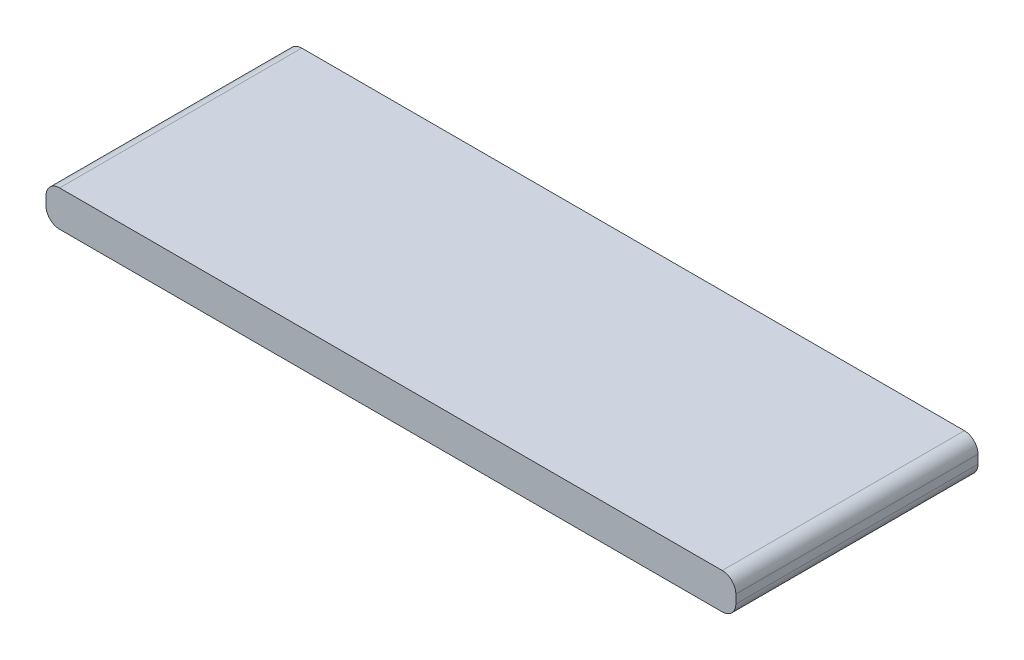
ISO-10303-21;
HEADER;
FILE_DESCRIPTION(('STEP AP214'),'2;1');
FILE_NAME('part.step','',(''),(''),'','','');
FILE_SCHEMA(('AUTOMOTIVE_DESIGN { 1 0 10303 214 1 1 1 1 }'));
ENDSEC;
DATA;
#1=APPLICATION_CONTEXT('core data for automotive mechanical design processes');
#2=APPLICATION_PROTOCOL_DEFINITION('international standard','automotive_design',2000,#1);
#3=PRODUCT_CONTEXT('',#1,'mechanical');
#4=PRODUCT('Part','Part','',(#3));
#5=PRODUCT_RELATED_PRODUCT_CATEGORY('part','',(#4));
#6=PRODUCT_DEFINITION_FORMATION('','',#4);
#7=PRODUCT_DEFINITION_CONTEXT('part definition',#1,'design');
#8=PRODUCT_DEFINITION('design','',#6,#7);
#9=PRODUCT_DEFINITION_SHAPE('','',#8);
#10=(LENGTH_UNIT() NAMED_UNIT(*) SI_UNIT(.MILLI.,.METRE.));
#11=(NAMED_UNIT(*) PLANE_ANGLE_UNIT() SI_UNIT($,.RADIAN.));
#12=(NAMED_UNIT(*) SI_UNIT($,.STERADIAN.) SOLID_ANGLE_UNIT());
#13=UNCERTAINTY_MEASURE_WITH_UNIT(LENGTH_MEASURE(1.E-05),#10,'distance_accuracy_value','');
#14=(GEOMETRIC_REPRESENTATION_CONTEXT(3) GLOBAL_UNCERTAINTY_ASSIGNED_CONTEXT((#13)) GLOBAL_UNIT_ASSIGNED_CONTEXT((#10,
#11,#12)) REPRESENTATION_CONTEXT('',''));
#15=CARTESIAN_POINT('',(0.,0.,0.));
#16=DIRECTION('',(0.,0.,1.));
#17=DIRECTION('',(1.,0.,0.));
#18=AXIS2_PLACEMENT_3D('',#15,#16,#17);
#19=CARTESIAN_POINT('',(152.4,0.,53.499999934));
#20=DIRECTION('',(0.,1.,0.));
#21=DIRECTION('',(-1.,0.,0.));
#22=AXIS2_PLACEMENT_3D('',#19,#20,#21);
#23=PLANE('',#22);
#24=DIRECTION('',(1.,0.,0.));
#25=VECTOR('',#24,1.);
#26=CARTESIAN_POINT('',(152.4,0.,0.));
#27=LINE('',#26,#25);
#28=CARTESIAN_POINT('',(3.00000000000006,0.,0.));
#29=VERTEX_POINT('',#28);
#30=CARTESIAN_POINT('',(149.4,0.,0.));
#31=VERTEX_POINT('',#30);
#32=EDGE_CURVE('E142',#29,#31,#27,.T.);
#33=ORIENTED_EDGE('',*,*,#32,.T.);
#34=DIRECTION('',(0.,0.,-1.));
#35=VECTOR('',#34,1.);
#36=CARTESIAN_POINT('',(149.4,0.,53.499999934));
#37=LINE('',#36,#35);
#38=CARTESIAN_POINT('',(149.4,0.,53.499999934));
#39=VERTEX_POINT('',#38);
#40=EDGE_CURVE('E164',#31,#39,#37,.F.);
#41=ORIENTED_EDGE('',*,*,#40,.T.);
#42=DIRECTION('',(1.,0.,0.));
#43=VECTOR('',#42,1.);
#44=CARTESIAN_POINT('',(152.4,0.,53.499999934));
#45=LINE('',#44,#43);
#46=CARTESIAN_POINT('',(3.00000000000006,0.,53.499999934));
#47=VERTEX_POINT('',#46);
#48=EDGE_CURVE('E140',#47,#39,#45,.T.);
#49=ORIENTED_EDGE('',*,*,#48,.F.);
#50=DIRECTION('',(0.,0.,-1.));
#51=VECTOR('',#50,1.);
#52=CARTESIAN_POINT('',(3.,0.,53.499999934));
#53=LINE('',#52,#51);
#54=EDGE_CURVE('E161',#47,#29,#53,.T.);
#55=ORIENTED_EDGE('',*,*,#54,.T.);
#56=EDGE_LOOP('',(#33,#41,#49,#55));
#57=FACE_BOUND('',#56,.T.);
#58=ADVANCED_FACE('F45',(#57),#23,.F.);
#59=CARTESIAN_POINT('',(152.4,7.92406687544473,53.499999934));
#60=DIRECTION('',(-1.,0.,0.));
#61=DIRECTION('',(0.,0.,1.));
#62=AXIS2_PLACEMENT_3D('',#59,#60,#61);
#63=PLANE('',#62);
#64=DIRECTION('',(0.,1.,0.));
#65=VECTOR('',#64,1.);
#66=CARTESIAN_POINT('',(152.4,7.92406687544473,0.));
#67=LINE('',#66,#65);
#68=CARTESIAN_POINT('',(152.4,3.00000000000002,0.));
#69=VERTEX_POINT('',#68);
#70=CARTESIAN_POINT('',(152.4,4.92406687544473,0.));
#71=VERTEX_POINT('',#70);
#72=EDGE_CURVE('E138',#69,#71,#67,.T.);
#73=ORIENTED_EDGE('',*,*,#72,.T.);
#74=DIRECTION('',(0.,0.,-1.));
#75=VECTOR('',#74,1.);
#76=CARTESIAN_POINT('',(152.4,4.92406687544473,53.499999934));
#77=LINE('',#76,#75);
#78=CARTESIAN_POINT('',(152.4,4.92406687544473,53.499999934));
#79=VERTEX_POINT('',#78);
#80=EDGE_CURVE('E116',#71,#79,#77,.F.);
#81=ORIENTED_EDGE('',*,*,#80,.T.);
#82=DIRECTION('',(0.,1.,0.));
#83=VECTOR('',#82,1.);
#84=CARTESIAN_POINT('',(152.4,7.92406687544473,53.499999934));
#85=LINE('',#84,#83);
#86=CARTESIAN_POINT('',(152.4,3.00000000000002,53.499999934));
#87=VERTEX_POINT('',#86);
#88=EDGE_CURVE('E178',#87,#79,#85,.T.);
#89=ORIENTED_EDGE('',*,*,#88,.F.);
#90=DIRECTION('',(0.,0.,-1.));
#91=VECTOR('',#90,1.);
#92=CARTESIAN_POINT('',(152.4,3.00000000000002,53.499999934));
#93=LINE('',#92,#91);
#94=EDGE_CURVE('E121',#87,#69,#93,.T.);
#95=ORIENTED_EDGE('',*,*,#94,.T.);
#96=EDGE_LOOP('',(#73,#81,#89,#95));
#97=FACE_BOUND('',#96,.T.);
#98=ADVANCED_FACE('F183',(#97),#63,.F.);
#99=CARTESIAN_POINT('',(152.4,7.92406687544473,53.499999934));
#100=DIRECTION('',(0.,-1.,0.));
#101=DIRECTION('',(1.,0.,0.));
#102=AXIS2_PLACEMENT_3D('',#99,#100,#101);
#103=PLANE('',#102);
#104=DIRECTION('',(-1.,0.,0.));
#105=VECTOR('',#104,1.);
#106=CARTESIAN_POINT('',(152.4,7.92406687544473,53.499999934));
#107=LINE('',#106,#105);
#108=CARTESIAN_POINT('',(149.4,7.92406687544473,53.499999934));
#109=VERTEX_POINT('',#108);
#110=CARTESIAN_POINT('',(3.00000000000006,7.92406687544471,53.499999934));
#111=VERTEX_POINT('',#110);
#112=EDGE_CURVE('E130',#109,#111,#107,.T.);
#113=ORIENTED_EDGE('',*,*,#112,.F.);
#114=DIRECTION('',(0.,0.,-1.));
#115=VECTOR('',#114,1.);
#116=CARTESIAN_POINT('',(149.4,7.92406687544473,53.499999934));
#117=LINE('',#116,#115);
#118=CARTESIAN_POINT('',(149.4,7.92406687544473,0.));
#119=VERTEX_POINT('',#118);
#120=EDGE_CURVE('E115',#109,#119,#117,.T.);
#121=ORIENTED_EDGE('',*,*,#120,.T.);
#122=DIRECTION('',(-1.,0.,0.));
#123=VECTOR('',#122,1.);
#124=CARTESIAN_POINT('',(152.4,7.92406687544473,0.));
#125=LINE('',#124,#123);
#126=CARTESIAN_POINT('',(3.00000000000006,7.92406687544471,0.));
#127=VERTEX_POINT('',#126);
#128=EDGE_CURVE('E128',#119,#127,#125,.T.);
#129=ORIENTED_EDGE('',*,*,#128,.T.);
#130=DIRECTION('',(0.,0.,-1.));
#131=VECTOR('',#130,1.);
#132=CARTESIAN_POINT('',(3.,7.92406687544471,53.499999934));
#133=LINE('',#132,#131);
#134=EDGE_CURVE('E132',#127,#111,#133,.F.);
#135=ORIENTED_EDGE('',*,*,#134,.T.);
#136=EDGE_LOOP('',(#113,#121,#129,#135));
#137=FACE_BOUND('',#136,.T.);
#138=ADVANCED_FACE('F127',(#137),#103,.F.);
#139=CARTESIAN_POINT('',(0.,7.92406687544471,53.499999934));
#140=DIRECTION('',(1.,0.,0.));
#141=DIRECTION('',(0.,0.,-1.));
#142=AXIS2_PLACEMENT_3D('',#139,#140,#141);
#143=PLANE('',#142);
#144=DIRECTION('',(0.,-1.,0.));
#145=VECTOR('',#144,1.);
#146=CARTESIAN_POINT('',(0.,7.92406687544471,53.499999934));
#147=LINE('',#146,#145);
#148=CARTESIAN_POINT('',(0.,4.92406687544471,53.499999934));
#149=VERTEX_POINT('',#148);
#150=CARTESIAN_POINT('',(0.,3.,53.499999934));
#151=VERTEX_POINT('',#150);
#152=EDGE_CURVE('E146',#149,#151,#147,.T.);
#153=ORIENTED_EDGE('',*,*,#152,.F.);
#154=DIRECTION('',(0.,0.,-1.));
#155=VECTOR('',#154,1.);
#156=CARTESIAN_POINT('',(0.,4.92406687544471,53.499999934));
#157=LINE('',#156,#155);
#158=CARTESIAN_POINT('',(0.,4.92406687544471,0.));
#159=VERTEX_POINT('',#158);
#160=EDGE_CURVE('E11',#149,#159,#157,.T.);
#161=ORIENTED_EDGE('',*,*,#160,.T.);
#162=DIRECTION('',(0.,-1.,0.));
#163=VECTOR('',#162,1.);
#164=CARTESIAN_POINT('',(0.,7.92406687544471,0.));
#165=LINE('',#164,#163);
#166=CARTESIAN_POINT('',(0.,3.,0.));
#167=VERTEX_POINT('',#166);
#168=EDGE_CURVE('E137',#159,#167,#165,.T.);
#169=ORIENTED_EDGE('',*,*,#168,.T.);
#170=DIRECTION('',(0.,0.,-1.));
#171=VECTOR('',#170,1.);
#172=CARTESIAN_POINT('',(0.,3.,53.499999934));
#173=LINE('',#172,#171);
#174=EDGE_CURVE('E53',#167,#151,#173,.F.);
#175=ORIENTED_EDGE('',*,*,#174,.T.);
#176=EDGE_LOOP('',(#153,#161,#169,#175));
#177=FACE_BOUND('',#176,.T.);
#178=ADVANCED_FACE('F190',(#177),#143,.F.);
#179=CARTESIAN_POINT('',(0.,0.,53.499999934));
#180=DIRECTION('',(0.,0.,1.));
#181=DIRECTION('',(1.,0.,0.));
#182=AXIS2_PLACEMENT_3D('',#179,#180,#181);
#183=PLANE('',#182);
#184=ORIENTED_EDGE('',*,*,#88,.T.);
#185=CARTESIAN_POINT('',(149.4,4.92406687544473,53.499999934));
#186=DIRECTION('',(0.,0.,1.));
#187=DIRECTION('',(1.,0.,0.));
#188=AXIS2_PLACEMENT_3D('',#185,#186,#187);
#189=CIRCLE('',#188,3.);
#190=EDGE_CURVE('E159',#79,#109,#189,.T.);
#191=ORIENTED_EDGE('',*,*,#190,.T.);
#192=ORIENTED_EDGE('',*,*,#112,.T.);
#193=CARTESIAN_POINT('',(3.,4.92406687544471,53.499999934));
#194=DIRECTION('',(0.,0.,1.));
#195=DIRECTION('',(1.,0.,0.));
#196=AXIS2_PLACEMENT_3D('',#193,#194,#195);
#197=CIRCLE('',#196,3.);
#198=EDGE_CURVE('E66',#111,#149,#197,.T.);
#199=ORIENTED_EDGE('',*,*,#198,.T.);
#200=ORIENTED_EDGE('',*,*,#152,.T.);
#201=CARTESIAN_POINT('',(3.,3.,53.499999934));
#202=DIRECTION('',(0.,0.,1.));
#203=DIRECTION('',(1.,0.,0.));
#204=AXIS2_PLACEMENT_3D('',#201,#202,#203);
#205=CIRCLE('',#204,3.);
#206=EDGE_CURVE('E154',#151,#47,#205,.T.);
#207=ORIENTED_EDGE('',*,*,#206,.T.);
#208=ORIENTED_EDGE('',*,*,#48,.T.);
#209=CARTESIAN_POINT('',(149.4,3.00000000000002,53.499999934));
#210=DIRECTION('',(0.,0.,1.));
#211=DIRECTION('',(1.,0.,0.));
#212=AXIS2_PLACEMENT_3D('',#209,#210,#211);
#213=CIRCLE('',#212,3.);
#214=EDGE_CURVE('E157',#39,#87,#213,.T.);
#215=ORIENTED_EDGE('',*,*,#214,.T.);
#216=EDGE_LOOP('',(#184,#191,#192,#199,#200,#207,#208,#215));
#217=FACE_BOUND('',#216,.T.);
#218=ADVANCED_FACE('F175',(#217),#183,.T.);
#219=CARTESIAN_POINT('',(0.,0.,0.));
#220=DIRECTION('',(0.,0.,1.));
#221=DIRECTION('',(1.,0.,0.));
#222=AXIS2_PLACEMENT_3D('',#219,#220,#221);
#223=PLANE('',#222);
#224=ORIENTED_EDGE('',*,*,#128,.F.);
#225=CARTESIAN_POINT('',(149.4,4.92406687544473,0.));
#226=DIRECTION('',(0.,0.,1.));
#227=DIRECTION('',(1.,0.,0.));
#228=AXIS2_PLACEMENT_3D('',#225,#226,#227);
#229=CIRCLE('',#228,3.);
#230=EDGE_CURVE('E111',#119,#71,#229,.F.);
#231=ORIENTED_EDGE('',*,*,#230,.T.);
#232=ORIENTED_EDGE('',*,*,#72,.F.);
#233=CARTESIAN_POINT('',(149.4,3.00000000000002,0.));
#234=DIRECTION('',(0.,0.,1.));
#235=DIRECTION('',(1.,0.,0.));
#236=AXIS2_PLACEMENT_3D('',#233,#234,#235);
#237=CIRCLE('',#236,3.);
#238=EDGE_CURVE('E122',#69,#31,#237,.F.);
#239=ORIENTED_EDGE('',*,*,#238,.T.);
#240=ORIENTED_EDGE('',*,*,#32,.F.);
#241=CARTESIAN_POINT('',(3.,3.,0.));
#242=DIRECTION('',(0.,0.,1.));
#243=DIRECTION('',(1.,0.,0.));
#244=AXIS2_PLACEMENT_3D('',#241,#242,#243);
#245=CIRCLE('',#244,3.);
#246=EDGE_CURVE('E131',#29,#167,#245,.F.);
#247=ORIENTED_EDGE('',*,*,#246,.T.);
#248=ORIENTED_EDGE('',*,*,#168,.F.);
#249=CARTESIAN_POINT('',(3.,4.92406687544471,0.));
#250=DIRECTION('',(0.,0.,1.));
#251=DIRECTION('',(1.,0.,0.));
#252=AXIS2_PLACEMENT_3D('',#249,#250,#251);
#253=CIRCLE('',#252,3.);
#254=EDGE_CURVE('E136',#159,#127,#253,.F.);
#255=ORIENTED_EDGE('',*,*,#254,.T.);
#256=EDGE_LOOP('',(#224,#231,#232,#239,#240,#247,#248,#255));
#257=FACE_BOUND('',#256,.T.);
#258=ADVANCED_FACE('F134',(#257),#223,.F.);
#259=CARTESIAN_POINT('',(149.4,4.92406687544473,53.499999934));
#260=DIRECTION('',(0.,0.,-1.));
#261=DIRECTION('',(-1.,0.,0.));
#262=AXIS2_PLACEMENT_3D('',#259,#260,#261);
#263=CYLINDRICAL_SURFACE('',#262,3.);
#264=ORIENTED_EDGE('',*,*,#190,.F.);
#265=ORIENTED_EDGE('',*,*,#80,.F.);
#266=ORIENTED_EDGE('',*,*,#230,.F.);
#267=ORIENTED_EDGE('',*,*,#120,.F.);
#268=EDGE_LOOP('',(#264,#265,#266,#267));
#269=FACE_BOUND('',#268,.T.);
#270=ADVANCED_FACE('F114',(#269),#263,.T.);
#271=CARTESIAN_POINT('',(149.4,3.00000000000002,53.499999934));
#272=DIRECTION('',(0.,0.,-1.));
#273=DIRECTION('',(-1.,0.,0.));
#274=AXIS2_PLACEMENT_3D('',#271,#272,#273);
#275=CYLINDRICAL_SURFACE('',#274,3.);
#276=ORIENTED_EDGE('',*,*,#214,.F.);
#277=ORIENTED_EDGE('',*,*,#40,.F.);
#278=ORIENTED_EDGE('',*,*,#238,.F.);
#279=ORIENTED_EDGE('',*,*,#94,.F.);
#280=EDGE_LOOP('',(#276,#277,#278,#279));
#281=FACE_BOUND('',#280,.T.);
#282=ADVANCED_FACE('F181',(#281),#275,.T.);
#283=CARTESIAN_POINT('',(3.,4.92406687544471,53.499999934));
#284=DIRECTION('',(0.,0.,-1.));
#285=DIRECTION('',(-1.,0.,0.));
#286=AXIS2_PLACEMENT_3D('',#283,#284,#285);
#287=CYLINDRICAL_SURFACE('',#286,3.);
#288=ORIENTED_EDGE('',*,*,#198,.F.);
#289=ORIENTED_EDGE('',*,*,#134,.F.);
#290=ORIENTED_EDGE('',*,*,#254,.F.);
#291=ORIENTED_EDGE('',*,*,#160,.F.);
#292=EDGE_LOOP('',(#288,#289,#290,#291));
#293=FACE_BOUND('',#292,.T.);
#294=ADVANCED_FACE('F189',(#293),#287,.T.);
#295=CARTESIAN_POINT('',(3.,3.,53.499999934));
#296=DIRECTION('',(0.,0.,-1.));
#297=DIRECTION('',(-1.,0.,0.));
#298=AXIS2_PLACEMENT_3D('',#295,#296,#297);
#299=CYLINDRICAL_SURFACE('',#298,3.);
#300=ORIENTED_EDGE('',*,*,#206,.F.);
#301=ORIENTED_EDGE('',*,*,#174,.F.);
#302=ORIENTED_EDGE('',*,*,#246,.F.);
#303=ORIENTED_EDGE('',*,*,#54,.F.);
#304=EDGE_LOOP('',(#300,#301,#302,#303));
#305=FACE_BOUND('',#304,.T.);
#306=ADVANCED_FACE('F47',(#305),#299,.T.);
#307=CLOSED_SHELL('',(#58,#98,#138,#178,#218,#258,#270,#282,#294,#306));
#308=MANIFOLD_SOLID_BREP('B2',#307);
#309=ADVANCED_BREP_SHAPE_REPRESENTATION('',(#18,#308),#14);
#310=SHAPE_DEFINITION_REPRESENTATION(#9,#309);
ENDSEC;
END-ISO-10303-21;
